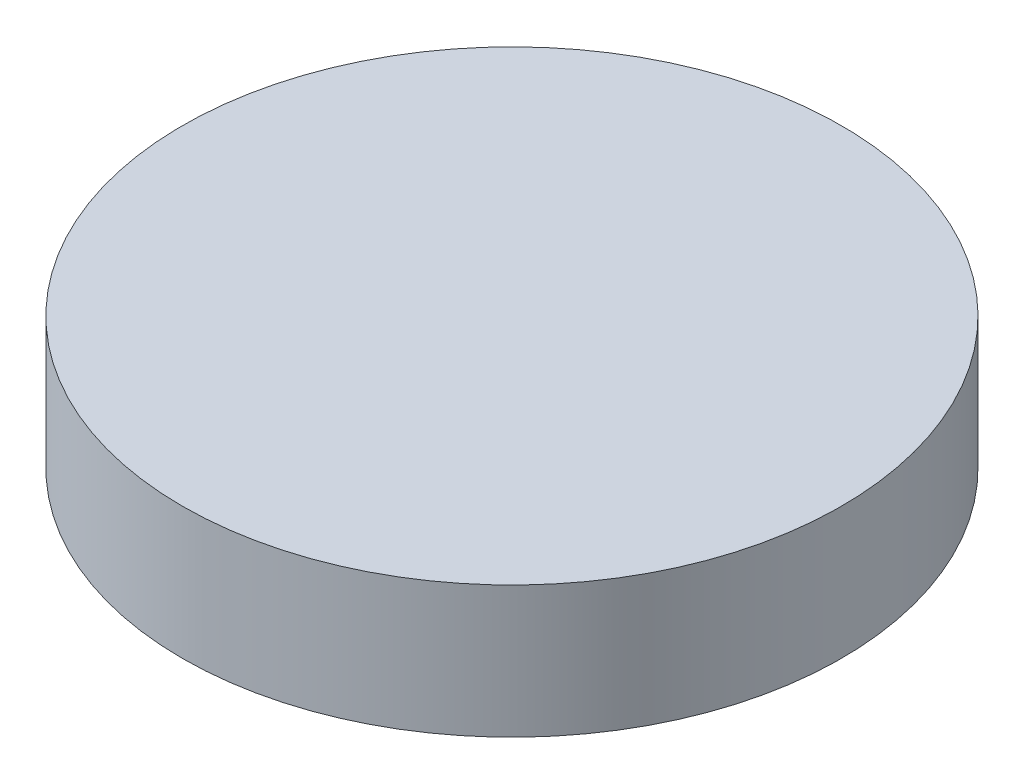
ISO-10303-21;
HEADER;
FILE_DESCRIPTION(('STEP AP214'),'2;1');
FILE_NAME('part.step','',(''),(''),'','','');
FILE_SCHEMA(('AUTOMOTIVE_DESIGN { 1 0 10303 214 1 1 1 1 }'));
ENDSEC;
DATA;
#1=APPLICATION_CONTEXT('core data for automotive mechanical design processes');
#2=APPLICATION_PROTOCOL_DEFINITION('international standard','automotive_design',2000,#1);
#3=PRODUCT_CONTEXT('',#1,'mechanical');
#4=PRODUCT('Part','Part','',(#3));
#5=PRODUCT_RELATED_PRODUCT_CATEGORY('part','',(#4));
#6=PRODUCT_DEFINITION_FORMATION('','',#4);
#7=PRODUCT_DEFINITION_CONTEXT('part definition',#1,'design');
#8=PRODUCT_DEFINITION('design','',#6,#7);
#9=PRODUCT_DEFINITION_SHAPE('','',#8);
#10=(LENGTH_UNIT() NAMED_UNIT(*) SI_UNIT(.MILLI.,.METRE.));
#11=(NAMED_UNIT(*) PLANE_ANGLE_UNIT() SI_UNIT($,.RADIAN.));
#12=(NAMED_UNIT(*) SI_UNIT($,.STERADIAN.) SOLID_ANGLE_UNIT());
#13=UNCERTAINTY_MEASURE_WITH_UNIT(LENGTH_MEASURE(1.E-05),#10,'distance_accuracy_value','');
#14=(GEOMETRIC_REPRESENTATION_CONTEXT(3) GLOBAL_UNCERTAINTY_ASSIGNED_CONTEXT((#13)) GLOBAL_UNIT_ASSIGNED_CONTEXT((#10,
#11,#12)) REPRESENTATION_CONTEXT('',''));
#15=CARTESIAN_POINT('',(0.,0.,0.));
#16=DIRECTION('',(0.,0.,1.));
#17=DIRECTION('',(1.,0.,0.));
#18=AXIS2_PLACEMENT_3D('',#15,#16,#17);
#19=CARTESIAN_POINT('',(0.,1.,0.));
#20=DIRECTION('',(0.,-1.,0.));
#21=DIRECTION('',(0.,0.,-1.));
#22=AXIS2_PLACEMENT_3D('',#19,#20,#21);
#23=CYLINDRICAL_SURFACE('',#22,2.5);
#24=CARTESIAN_POINT('',(0.,1.,0.));
#25=DIRECTION('',(0.,1.,0.));
#26=DIRECTION('',(0.,0.,1.));
#27=AXIS2_PLACEMENT_3D('',#24,#25,#26);
#28=CIRCLE('',#27,2.5);
#29=CARTESIAN_POINT('',(0.,1.,2.5));
#30=VERTEX_POINT('',#29);
#31=EDGE_CURVE('E10',#30,#30,#28,.T.);
#32=ORIENTED_EDGE('',*,*,#31,.F.);
#33=EDGE_LOOP('',(#32));
#34=FACE_BOUND('',#33,.T.);
#35=CARTESIAN_POINT('',(0.,0.,0.));
#36=DIRECTION('',(0.,1.,0.));
#37=DIRECTION('',(0.,0.,1.));
#38=AXIS2_PLACEMENT_3D('',#35,#36,#37);
#39=CIRCLE('',#38,2.5);
#40=CARTESIAN_POINT('',(0.,0.,2.5));
#41=VERTEX_POINT('',#40);
#42=EDGE_CURVE('E34',#41,#41,#39,.T.);
#43=ORIENTED_EDGE('',*,*,#42,.T.);
#44=EDGE_LOOP('',(#43));
#45=FACE_BOUND('',#44,.T.);
#46=ADVANCED_FACE('F31',(#34,#45),#23,.T.);
#47=CARTESIAN_POINT('',(0.,1.,0.));
#48=DIRECTION('',(0.,1.,0.));
#49=DIRECTION('',(0.,0.,1.));
#50=AXIS2_PLACEMENT_3D('',#47,#48,#49);
#51=PLANE('',#50);
#52=ORIENTED_EDGE('',*,*,#31,.T.);
#53=EDGE_LOOP('',(#52));
#54=FACE_BOUND('',#53,.T.);
#55=ADVANCED_FACE('F46',(#54),#51,.T.);
#56=CARTESIAN_POINT('',(0.,0.,0.));
#57=DIRECTION('',(0.,1.,0.));
#58=DIRECTION('',(0.,0.,1.));
#59=AXIS2_PLACEMENT_3D('',#56,#57,#58);
#60=PLANE('',#59);
#61=ORIENTED_EDGE('',*,*,#42,.F.);
#62=EDGE_LOOP('',(#61));
#63=FACE_BOUND('',#62,.T.);
#64=ADVANCED_FACE('F44',(#63),#60,.F.);
#65=CLOSED_SHELL('',(#46,#55,#64));
#66=MANIFOLD_SOLID_BREP('B2',#65);
#67=ADVANCED_BREP_SHAPE_REPRESENTATION('',(#18,#66),#14);
#68=SHAPE_DEFINITION_REPRESENTATION(#9,#67);
ENDSEC;
END-ISO-10303-21;
